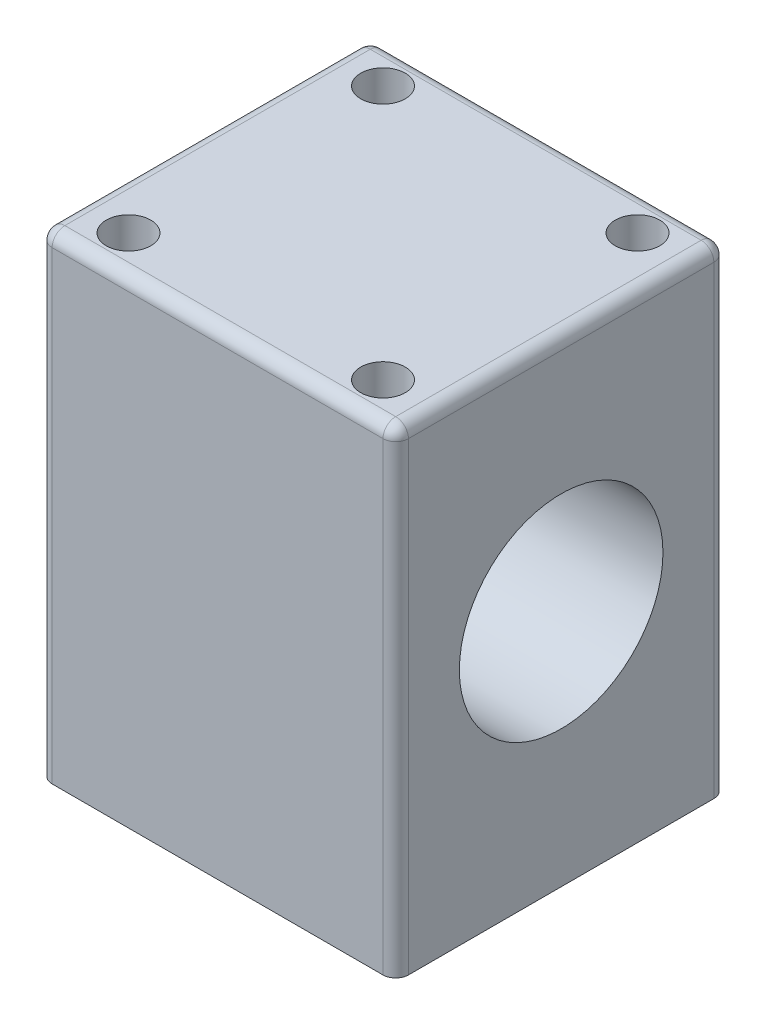
ISO-10303-21;
HEADER;
FILE_DESCRIPTION(('STEP AP214'),'2;1');
FILE_NAME('part.step','',(''),(''),'','','');
FILE_SCHEMA(('AUTOMOTIVE_DESIGN { 1 0 10303 214 1 1 1 1 }'));
ENDSEC;
DATA;
#1=APPLICATION_CONTEXT('core data for automotive mechanical design processes');
#2=APPLICATION_PROTOCOL_DEFINITION('international standard','automotive_design',2000,#1);
#3=PRODUCT_CONTEXT('',#1,'mechanical');
#4=PRODUCT('Part','Part','',(#3));
#5=PRODUCT_RELATED_PRODUCT_CATEGORY('part','',(#4));
#6=PRODUCT_DEFINITION_FORMATION('','',#4);
#7=PRODUCT_DEFINITION_CONTEXT('part definition',#1,'design');
#8=PRODUCT_DEFINITION('design','',#6,#7);
#9=PRODUCT_DEFINITION_SHAPE('','',#8);
#10=(LENGTH_UNIT() NAMED_UNIT(*) SI_UNIT(.MILLI.,.METRE.));
#11=(NAMED_UNIT(*) PLANE_ANGLE_UNIT() SI_UNIT($,.RADIAN.));
#12=(NAMED_UNIT(*) SI_UNIT($,.STERADIAN.) SOLID_ANGLE_UNIT());
#13=UNCERTAINTY_MEASURE_WITH_UNIT(LENGTH_MEASURE(1.E-05),#10,'distance_accuracy_value','');
#14=(GEOMETRIC_REPRESENTATION_CONTEXT(3) GLOBAL_UNCERTAINTY_ASSIGNED_CONTEXT((#13)) GLOBAL_UNIT_ASSIGNED_CONTEXT((#10,
#11,#12)) REPRESENTATION_CONTEXT('',''));
#15=CARTESIAN_POINT('',(0.,0.,0.));
#16=DIRECTION('',(0.,0.,1.));
#17=DIRECTION('',(1.,0.,0.));
#18=AXIS2_PLACEMENT_3D('',#15,#16,#17);
#19=CARTESIAN_POINT('',(14.,0.,0.));
#20=DIRECTION('',(-1.,0.,0.));
#21=DIRECTION('',(0.,0.,1.));
#22=AXIS2_PLACEMENT_3D('',#19,#20,#21);
#23=CYLINDRICAL_SURFACE('',#22,8.);
#24=CARTESIAN_POINT('',(14.,0.,0.));
#25=DIRECTION('',(1.,0.,0.));
#26=DIRECTION('',(0.,0.,-1.));
#27=AXIS2_PLACEMENT_3D('',#24,#25,#26);
#28=CIRCLE('',#27,8.);
#29=CARTESIAN_POINT('',(14.,0.,-8.));
#30=VERTEX_POINT('',#29);
#31=EDGE_CURVE('E241',#30,#30,#28,.T.);
#32=ORIENTED_EDGE('',*,*,#31,.T.);
#33=EDGE_LOOP('',(#32));
#34=FACE_BOUND('',#33,.T.);
#35=CARTESIAN_POINT('',(-11.,0.,0.));
#36=DIRECTION('',(-1.,0.,0.));
#37=DIRECTION('',(0.,0.,1.));
#38=AXIS2_PLACEMENT_3D('',#35,#36,#37);
#39=CIRCLE('',#38,8.);
#40=CARTESIAN_POINT('',(-11.,0.,8.));
#41=VERTEX_POINT('',#40);
#42=EDGE_CURVE('E216',#41,#41,#39,.T.);
#43=ORIENTED_EDGE('',*,*,#42,.T.);
#44=EDGE_LOOP('',(#43));
#45=FACE_BOUND('',#44,.T.);
#46=ADVANCED_FACE('F37',(#34,#45),#23,.F.);
#47=CARTESIAN_POINT('',(14.,0.,0.));
#48=DIRECTION('',(-1.,0.,0.));
#49=DIRECTION('',(0.,0.,1.));
#50=AXIS2_PLACEMENT_3D('',#47,#48,#49);
#51=PLANE('',#50);
#52=DIRECTION('',(0.,0.,1.));
#53=VECTOR('',#52,1.);
#54=CARTESIAN_POINT('',(14.,17.75,0.));
#55=LINE('',#54,#53);
#56=CARTESIAN_POINT('',(14.,17.75,-12.));
#57=VERTEX_POINT('',#56);
#58=CARTESIAN_POINT('',(14.,17.75,12.));
#59=VERTEX_POINT('',#58);
#60=EDGE_CURVE('E160',#57,#59,#55,.T.);
#61=ORIENTED_EDGE('',*,*,#60,.T.);
#62=DIRECTION('',(0.,-1.,0.));
#63=VECTOR('',#62,1.);
#64=CARTESIAN_POINT('',(14.,0.,12.));
#65=LINE('',#64,#63);
#66=CARTESIAN_POINT('',(14.,-18.75,12.));
#67=VERTEX_POINT('',#66);
#68=EDGE_CURVE('E164',#59,#67,#65,.T.);
#69=ORIENTED_EDGE('',*,*,#68,.T.);
#70=DIRECTION('',(0.,0.,-1.));
#71=VECTOR('',#70,1.);
#72=CARTESIAN_POINT('',(14.,-18.75,13.));
#73=LINE('',#72,#71);
#74=CARTESIAN_POINT('',(14.,-18.75,-12.));
#75=VERTEX_POINT('',#74);
#76=EDGE_CURVE('E124',#67,#75,#73,.T.);
#77=ORIENTED_EDGE('',*,*,#76,.T.);
#78=DIRECTION('',(0.,1.,0.));
#79=VECTOR('',#78,1.);
#80=CARTESIAN_POINT('',(14.,0.,-12.));
#81=LINE('',#80,#79);
#82=EDGE_CURVE('E162',#75,#57,#81,.T.);
#83=ORIENTED_EDGE('',*,*,#82,.T.);
#84=EDGE_LOOP('',(#61,#69,#77,#83));
#85=FACE_BOUND('',#84,.T.);
#86=ORIENTED_EDGE('',*,*,#31,.F.);
#87=EDGE_LOOP('',(#86));
#88=FACE_BOUND('',#87,.T.);
#89=ADVANCED_FACE('F272',(#85,#88),#51,.F.);
#90=CARTESIAN_POINT('',(-14.,0.,0.));
#91=DIRECTION('',(-1.,0.,0.));
#92=DIRECTION('',(0.,0.,1.));
#93=AXIS2_PLACEMENT_3D('',#90,#91,#92);
#94=PLANE('',#93);
#95=DIRECTION('',(0.,0.,-1.));
#96=VECTOR('',#95,1.);
#97=CARTESIAN_POINT('',(-14.,-18.75,13.));
#98=LINE('',#97,#96);
#99=CARTESIAN_POINT('',(-14.,-18.75,12.));
#100=VERTEX_POINT('',#99);
#101=CARTESIAN_POINT('',(-14.,-18.75,-12.));
#102=VERTEX_POINT('',#101);
#103=EDGE_CURVE('E246',#100,#102,#98,.T.);
#104=ORIENTED_EDGE('',*,*,#103,.F.);
#105=DIRECTION('',(0.,-1.,0.));
#106=VECTOR('',#105,1.);
#107=CARTESIAN_POINT('',(-14.,18.75,12.));
#108=LINE('',#107,#106);
#109=CARTESIAN_POINT('',(-14.,17.75,12.));
#110=VERTEX_POINT('',#109);
#111=EDGE_CURVE('E158',#100,#110,#108,.F.);
#112=ORIENTED_EDGE('',*,*,#111,.T.);
#113=DIRECTION('',(0.,0.,1.));
#114=VECTOR('',#113,1.);
#115=CARTESIAN_POINT('',(-14.,17.75,-13.));
#116=LINE('',#115,#114);
#117=CARTESIAN_POINT('',(-14.,17.75,-12.));
#118=VERTEX_POINT('',#117);
#119=EDGE_CURVE('E154',#110,#118,#116,.F.);
#120=ORIENTED_EDGE('',*,*,#119,.T.);
#121=DIRECTION('',(0.,1.,0.));
#122=VECTOR('',#121,1.);
#123=CARTESIAN_POINT('',(-14.,-18.75,-12.));
#124=LINE('',#123,#122);
#125=EDGE_CURVE('E156',#118,#102,#124,.F.);
#126=ORIENTED_EDGE('',*,*,#125,.T.);
#127=EDGE_LOOP('',(#104,#112,#120,#126));
#128=FACE_BOUND('',#127,.T.);
#129=CARTESIAN_POINT('',(-14.,0.,0.));
#130=DIRECTION('',(-1.,0.,0.));
#131=DIRECTION('',(0.,0.,1.));
#132=AXIS2_PLACEMENT_3D('',#129,#130,#131);
#133=CIRCLE('',#132,6.);
#134=CARTESIAN_POINT('',(-14.,0.,6.));
#135=VERTEX_POINT('',#134);
#136=EDGE_CURVE('E206',#135,#135,#133,.T.);
#137=ORIENTED_EDGE('',*,*,#136,.F.);
#138=EDGE_LOOP('',(#137));
#139=FACE_BOUND('',#138,.T.);
#140=ADVANCED_FACE('F278',(#128,#139),#94,.T.);
#141=CARTESIAN_POINT('',(14.,-18.75,-13.));
#142=DIRECTION('',(0.,0.,1.));
#143=DIRECTION('',(1.,0.,0.));
#144=AXIS2_PLACEMENT_3D('',#141,#142,#143);
#145=PLANE('',#144);
#146=DIRECTION('',(-1.,0.,0.));
#147=VECTOR('',#146,1.);
#148=CARTESIAN_POINT('',(14.,-18.75,-13.));
#149=LINE('',#148,#147);
#150=CARTESIAN_POINT('',(13.,-18.75,-13.));
#151=VERTEX_POINT('',#150);
#152=CARTESIAN_POINT('',(-13.,-18.75,-13.));
#153=VERTEX_POINT('',#152);
#154=EDGE_CURVE('E139',#151,#153,#149,.T.);
#155=ORIENTED_EDGE('',*,*,#154,.T.);
#156=DIRECTION('',(0.,1.,0.));
#157=VECTOR('',#156,1.);
#158=CARTESIAN_POINT('',(-13.,18.75,-13.));
#159=LINE('',#158,#157);
#160=CARTESIAN_POINT('',(-13.,17.75,-13.));
#161=VERTEX_POINT('',#160);
#162=EDGE_CURVE('E170',#153,#161,#159,.T.);
#163=ORIENTED_EDGE('',*,*,#162,.T.);
#164=DIRECTION('',(-1.,0.,0.));
#165=VECTOR('',#164,1.);
#166=CARTESIAN_POINT('',(14.,17.75,-13.));
#167=LINE('',#166,#165);
#168=CARTESIAN_POINT('',(13.,17.75,-13.));
#169=VERTEX_POINT('',#168);
#170=EDGE_CURVE('E166',#161,#169,#167,.F.);
#171=ORIENTED_EDGE('',*,*,#170,.T.);
#172=DIRECTION('',(0.,1.,0.));
#173=VECTOR('',#172,1.);
#174=CARTESIAN_POINT('',(13.,-18.75,-13.));
#175=LINE('',#174,#173);
#176=EDGE_CURVE('E168',#169,#151,#175,.F.);
#177=ORIENTED_EDGE('',*,*,#176,.T.);
#178=EDGE_LOOP('',(#155,#163,#171,#177));
#179=FACE_BOUND('',#178,.T.);
#180=ADVANCED_FACE('F287',(#179),#145,.F.);
#181=CARTESIAN_POINT('',(14.,18.75,13.));
#182=DIRECTION('',(0.,-1.,0.));
#183=DIRECTION('',(0.,0.,-1.));
#184=AXIS2_PLACEMENT_3D('',#181,#182,#183);
#185=PLANE('',#184);
#186=DIRECTION('',(-1.,0.,0.));
#187=VECTOR('',#186,1.);
#188=CARTESIAN_POINT('',(14.,18.75,-12.));
#189=LINE('',#188,#187);
#190=CARTESIAN_POINT('',(13.,18.75,-12.));
#191=VERTEX_POINT('',#190);
#192=CARTESIAN_POINT('',(-13.,18.75,-12.));
#193=VERTEX_POINT('',#192);
#194=EDGE_CURVE('E61',#191,#193,#189,.T.);
#195=ORIENTED_EDGE('',*,*,#194,.T.);
#196=DIRECTION('',(0.,0.,1.));
#197=VECTOR('',#196,1.);
#198=CARTESIAN_POINT('',(-13.,18.75,13.));
#199=LINE('',#198,#197);
#200=CARTESIAN_POINT('',(-13.,18.75,12.));
#201=VERTEX_POINT('',#200);
#202=EDGE_CURVE('E11',#193,#201,#199,.T.);
#203=ORIENTED_EDGE('',*,*,#202,.T.);
#204=DIRECTION('',(-1.,0.,0.));
#205=VECTOR('',#204,1.);
#206=CARTESIAN_POINT('',(14.,18.75,12.));
#207=LINE('',#206,#205);
#208=CARTESIAN_POINT('',(13.,18.75,12.));
#209=VERTEX_POINT('',#208);
#210=EDGE_CURVE('E46',#201,#209,#207,.F.);
#211=ORIENTED_EDGE('',*,*,#210,.T.);
#212=DIRECTION('',(0.,0.,1.));
#213=VECTOR('',#212,1.);
#214=CARTESIAN_POINT('',(13.,18.75,13.));
#215=LINE('',#214,#213);
#216=EDGE_CURVE('E172',#209,#191,#215,.F.);
#217=ORIENTED_EDGE('',*,*,#216,.T.);
#218=EDGE_LOOP('',(#195,#203,#211,#217));
#219=FACE_BOUND('',#218,.T.);
#220=CARTESIAN_POINT('',(-10.,18.75,10.));
#221=DIRECTION('',(0.,1.,0.));
#222=DIRECTION('',(0.,0.,1.));
#223=AXIS2_PLACEMENT_3D('',#220,#221,#222);
#224=CIRCLE('',#223,1.75);
#225=CARTESIAN_POINT('',(-10.,18.75,11.75));
#226=VERTEX_POINT('',#225);
#227=EDGE_CURVE('E235',#226,#226,#224,.T.);
#228=ORIENTED_EDGE('',*,*,#227,.F.);
#229=EDGE_LOOP('',(#228));
#230=FACE_BOUND('',#229,.T.);
#231=CARTESIAN_POINT('',(10.,18.75,9.99999999999999));
#232=DIRECTION('',(0.,1.,0.));
#233=DIRECTION('',(0.,0.,1.));
#234=AXIS2_PLACEMENT_3D('',#231,#232,#233);
#235=CIRCLE('',#234,1.75);
#236=CARTESIAN_POINT('',(10.,18.75,11.75));
#237=VERTEX_POINT('',#236);
#238=EDGE_CURVE('E229',#237,#237,#235,.T.);
#239=ORIENTED_EDGE('',*,*,#238,.F.);
#240=EDGE_LOOP('',(#239));
#241=FACE_BOUND('',#240,.T.);
#242=CARTESIAN_POINT('',(10.,18.75,-10.));
#243=DIRECTION('',(0.,1.,0.));
#244=DIRECTION('',(0.,0.,1.));
#245=AXIS2_PLACEMENT_3D('',#242,#243,#244);
#246=CIRCLE('',#245,1.75);
#247=CARTESIAN_POINT('',(10.,18.75,-8.25000000000001));
#248=VERTEX_POINT('',#247);
#249=EDGE_CURVE('E223',#248,#248,#246,.T.);
#250=ORIENTED_EDGE('',*,*,#249,.F.);
#251=EDGE_LOOP('',(#250));
#252=FACE_BOUND('',#251,.T.);
#253=CARTESIAN_POINT('',(-10.,18.75,-10.));
#254=DIRECTION('',(0.,1.,0.));
#255=DIRECTION('',(0.,0.,1.));
#256=AXIS2_PLACEMENT_3D('',#253,#254,#255);
#257=CIRCLE('',#256,1.75);
#258=CARTESIAN_POINT('',(-10.,18.75,-8.25));
#259=VERTEX_POINT('',#258);
#260=EDGE_CURVE('E222',#259,#259,#257,.T.);
#261=ORIENTED_EDGE('',*,*,#260,.F.);
#262=EDGE_LOOP('',(#261));
#263=FACE_BOUND('',#262,.T.);
#264=ADVANCED_FACE('F293',(#219,#230,#241,#252,#263),#185,.F.);
#265=CARTESIAN_POINT('',(14.,-18.75,13.));
#266=DIRECTION('',(0.,0.,-1.));
#267=DIRECTION('',(-1.,0.,0.));
#268=AXIS2_PLACEMENT_3D('',#265,#266,#267);
#269=PLANE('',#268);
#270=DIRECTION('',(-1.,0.,0.));
#271=VECTOR('',#270,1.);
#272=CARTESIAN_POINT('',(14.,17.75,13.));
#273=LINE('',#272,#271);
#274=CARTESIAN_POINT('',(13.,17.75,13.));
#275=VERTEX_POINT('',#274);
#276=CARTESIAN_POINT('',(-13.,17.75,13.));
#277=VERTEX_POINT('',#276);
#278=EDGE_CURVE('E138',#275,#277,#273,.T.);
#279=ORIENTED_EDGE('',*,*,#278,.T.);
#280=DIRECTION('',(0.,-1.,0.));
#281=VECTOR('',#280,1.);
#282=CARTESIAN_POINT('',(-13.,-18.75,13.));
#283=LINE('',#282,#281);
#284=CARTESIAN_POINT('',(-13.,-18.75,13.));
#285=VERTEX_POINT('',#284);
#286=EDGE_CURVE('E137',#277,#285,#283,.T.);
#287=ORIENTED_EDGE('',*,*,#286,.T.);
#288=DIRECTION('',(-1.,0.,0.));
#289=VECTOR('',#288,1.);
#290=CARTESIAN_POINT('',(14.,-18.75,13.));
#291=LINE('',#290,#289);
#292=CARTESIAN_POINT('',(13.,-18.75,13.));
#293=VERTEX_POINT('',#292);
#294=EDGE_CURVE('E122',#293,#285,#291,.T.);
#295=ORIENTED_EDGE('',*,*,#294,.F.);
#296=DIRECTION('',(0.,-1.,0.));
#297=VECTOR('',#296,1.);
#298=CARTESIAN_POINT('',(13.,-18.75,13.));
#299=LINE('',#298,#297);
#300=EDGE_CURVE('E134',#293,#275,#299,.F.);
#301=ORIENTED_EDGE('',*,*,#300,.T.);
#302=EDGE_LOOP('',(#279,#287,#295,#301));
#303=FACE_BOUND('',#302,.T.);
#304=ADVANCED_FACE('F133',(#303),#269,.F.);
#305=CARTESIAN_POINT('',(14.,-18.75,13.));
#306=DIRECTION('',(0.,1.,0.));
#307=DIRECTION('',(0.,0.,1.));
#308=AXIS2_PLACEMENT_3D('',#305,#306,#307);
#309=PLANE('',#308);
#310=ORIENTED_EDGE('',*,*,#294,.T.);
#311=CARTESIAN_POINT('',(-13.,-18.75,12.));
#312=DIRECTION('',(0.,1.,0.));
#313=DIRECTION('',(0.,0.,1.));
#314=AXIS2_PLACEMENT_3D('',#311,#312,#313);
#315=CIRCLE('',#314,1.);
#316=EDGE_CURVE('E128',#285,#100,#315,.F.);
#317=ORIENTED_EDGE('',*,*,#316,.T.);
#318=ORIENTED_EDGE('',*,*,#103,.T.);
#319=CARTESIAN_POINT('',(-13.,-18.75,-12.));
#320=DIRECTION('',(0.,1.,0.));
#321=DIRECTION('',(0.,0.,1.));
#322=AXIS2_PLACEMENT_3D('',#319,#320,#321);
#323=CIRCLE('',#322,1.);
#324=EDGE_CURVE('E129',#102,#153,#323,.F.);
#325=ORIENTED_EDGE('',*,*,#324,.T.);
#326=ORIENTED_EDGE('',*,*,#154,.F.);
#327=CARTESIAN_POINT('',(13.,-18.75,-12.));
#328=DIRECTION('',(0.,1.,0.));
#329=DIRECTION('',(0.,0.,1.));
#330=AXIS2_PLACEMENT_3D('',#327,#328,#329);
#331=CIRCLE('',#330,1.);
#332=EDGE_CURVE('E146',#151,#75,#331,.F.);
#333=ORIENTED_EDGE('',*,*,#332,.T.);
#334=ORIENTED_EDGE('',*,*,#76,.F.);
#335=CARTESIAN_POINT('',(13.,-18.75,12.));
#336=DIRECTION('',(0.,1.,0.));
#337=DIRECTION('',(0.,0.,1.));
#338=AXIS2_PLACEMENT_3D('',#335,#336,#337);
#339=CIRCLE('',#338,1.);
#340=EDGE_CURVE('E119',#67,#293,#339,.F.);
#341=ORIENTED_EDGE('',*,*,#340,.T.);
#342=EDGE_LOOP('',(#310,#317,#318,#325,#326,#333,#334,#341));
#343=FACE_BOUND('',#342,.T.);
#344=ADVANCED_FACE('F121',(#343),#309,.F.);
#345=CARTESIAN_POINT('',(-10.,-13.25,-10.));
#346=DIRECTION('',(0.,1.,0.));
#347=DIRECTION('',(0.,0.,1.));
#348=AXIS2_PLACEMENT_3D('',#345,#346,#347);
#349=CYLINDRICAL_SURFACE('',#348,1.75);
#350=CARTESIAN_POINT('',(-10.,-13.25,-10.));
#351=DIRECTION('',(0.,1.,0.));
#352=DIRECTION('',(0.,0.,1.));
#353=AXIS2_PLACEMENT_3D('',#350,#351,#352);
#354=CIRCLE('',#353,1.75);
#355=CARTESIAN_POINT('',(-10.,-13.25,-8.25));
#356=VERTEX_POINT('',#355);
#357=EDGE_CURVE('E238',#356,#356,#354,.T.);
#358=ORIENTED_EDGE('',*,*,#357,.F.);
#359=EDGE_LOOP('',(#358));
#360=FACE_BOUND('',#359,.T.);
#361=ORIENTED_EDGE('',*,*,#260,.T.);
#362=EDGE_LOOP('',(#361));
#363=FACE_BOUND('',#362,.T.);
#364=ADVANCED_FACE('F282',(#360,#363),#349,.F.);
#365=CARTESIAN_POINT('',(-10.,-13.25,-10.));
#366=DIRECTION('',(0.,1.,0.));
#367=DIRECTION('',(0.,0.,1.));
#368=AXIS2_PLACEMENT_3D('',#365,#366,#367);
#369=PLANE('',#368);
#370=ORIENTED_EDGE('',*,*,#357,.T.);
#371=EDGE_LOOP('',(#370));
#372=FACE_BOUND('',#371,.T.);
#373=ADVANCED_FACE('F370',(#372),#369,.T.);
#374=CARTESIAN_POINT('',(10.,-13.25,-10.));
#375=DIRECTION('',(0.,1.,0.));
#376=DIRECTION('',(0.,0.,1.));
#377=AXIS2_PLACEMENT_3D('',#374,#375,#376);
#378=CYLINDRICAL_SURFACE('',#377,1.75);
#379=CARTESIAN_POINT('',(10.,-13.25,-10.));
#380=DIRECTION('',(0.,1.,0.));
#381=DIRECTION('',(0.,0.,1.));
#382=AXIS2_PLACEMENT_3D('',#379,#380,#381);
#383=CIRCLE('',#382,1.75);
#384=CARTESIAN_POINT('',(10.,-13.25,-8.25000000000001));
#385=VERTEX_POINT('',#384);
#386=EDGE_CURVE('E219',#385,#385,#383,.T.);
#387=ORIENTED_EDGE('',*,*,#386,.F.);
#388=EDGE_LOOP('',(#387));
#389=FACE_BOUND('',#388,.T.);
#390=ORIENTED_EDGE('',*,*,#249,.T.);
#391=EDGE_LOOP('',(#390));
#392=FACE_BOUND('',#391,.T.);
#393=ADVANCED_FACE('F375',(#389,#392),#378,.F.);
#394=CARTESIAN_POINT('',(10.,-13.25,-10.));
#395=DIRECTION('',(0.,1.,0.));
#396=DIRECTION('',(0.,0.,1.));
#397=AXIS2_PLACEMENT_3D('',#394,#395,#396);
#398=PLANE('',#397);
#399=ORIENTED_EDGE('',*,*,#386,.T.);
#400=EDGE_LOOP('',(#399));
#401=FACE_BOUND('',#400,.T.);
#402=ADVANCED_FACE('F381',(#401),#398,.T.);
#403=CARTESIAN_POINT('',(10.,-13.25,9.99999999999999));
#404=DIRECTION('',(0.,1.,0.));
#405=DIRECTION('',(0.,0.,1.));
#406=AXIS2_PLACEMENT_3D('',#403,#404,#405);
#407=CYLINDRICAL_SURFACE('',#406,1.75);
#408=CARTESIAN_POINT('',(10.,-13.25,9.99999999999999));
#409=DIRECTION('',(0.,1.,0.));
#410=DIRECTION('',(0.,0.,1.));
#411=AXIS2_PLACEMENT_3D('',#408,#409,#410);
#412=CIRCLE('',#411,1.75);
#413=CARTESIAN_POINT('',(10.,-13.25,11.75));
#414=VERTEX_POINT('',#413);
#415=EDGE_CURVE('E226',#414,#414,#412,.T.);
#416=ORIENTED_EDGE('',*,*,#415,.F.);
#417=EDGE_LOOP('',(#416));
#418=FACE_BOUND('',#417,.T.);
#419=ORIENTED_EDGE('',*,*,#238,.T.);
#420=EDGE_LOOP('',(#419));
#421=FACE_BOUND('',#420,.T.);
#422=ADVANCED_FACE('F389',(#418,#421),#407,.F.);
#423=CARTESIAN_POINT('',(10.,-13.25,9.99999999999999));
#424=DIRECTION('',(0.,1.,0.));
#425=DIRECTION('',(0.,0.,1.));
#426=AXIS2_PLACEMENT_3D('',#423,#424,#425);
#427=PLANE('',#426);
#428=ORIENTED_EDGE('',*,*,#415,.T.);
#429=EDGE_LOOP('',(#428));
#430=FACE_BOUND('',#429,.T.);
#431=ADVANCED_FACE('F386',(#430),#427,.T.);
#432=CARTESIAN_POINT('',(-10.,-13.25,10.));
#433=DIRECTION('',(0.,1.,0.));
#434=DIRECTION('',(0.,0.,1.));
#435=AXIS2_PLACEMENT_3D('',#432,#433,#434);
#436=CYLINDRICAL_SURFACE('',#435,1.75);
#437=CARTESIAN_POINT('',(-10.,-13.25,10.));
#438=DIRECTION('',(0.,1.,0.));
#439=DIRECTION('',(0.,0.,1.));
#440=AXIS2_PLACEMENT_3D('',#437,#438,#439);
#441=CIRCLE('',#440,1.75);
#442=CARTESIAN_POINT('',(-10.,-13.25,11.75));
#443=VERTEX_POINT('',#442);
#444=EDGE_CURVE('E232',#443,#443,#441,.T.);
#445=ORIENTED_EDGE('',*,*,#444,.F.);
#446=EDGE_LOOP('',(#445));
#447=FACE_BOUND('',#446,.T.);
#448=ORIENTED_EDGE('',*,*,#227,.T.);
#449=EDGE_LOOP('',(#448));
#450=FACE_BOUND('',#449,.T.);
#451=ADVANCED_FACE('F267',(#447,#450),#436,.F.);
#452=CARTESIAN_POINT('',(-10.,-13.25,10.));
#453=DIRECTION('',(0.,1.,0.));
#454=DIRECTION('',(0.,0.,1.));
#455=AXIS2_PLACEMENT_3D('',#452,#453,#454);
#456=PLANE('',#455);
#457=ORIENTED_EDGE('',*,*,#444,.T.);
#458=EDGE_LOOP('',(#457));
#459=FACE_BOUND('',#458,.T.);
#460=ADVANCED_FACE('F258',(#459),#456,.T.);
#461=CARTESIAN_POINT('',(-11.,0.,0.));
#462=DIRECTION('',(-1.,0.,0.));
#463=DIRECTION('',(0.,0.,1.));
#464=AXIS2_PLACEMENT_3D('',#461,#462,#463);
#465=PLANE('',#464);
#466=CARTESIAN_POINT('',(-11.,0.,0.));
#467=DIRECTION('',(-1.,0.,0.));
#468=DIRECTION('',(0.,0.,1.));
#469=AXIS2_PLACEMENT_3D('',#466,#467,#468);
#470=CIRCLE('',#469,6.);
#471=CARTESIAN_POINT('',(-11.,0.,6.));
#472=VERTEX_POINT('',#471);
#473=EDGE_CURVE('E211',#472,#472,#470,.T.);
#474=ORIENTED_EDGE('',*,*,#473,.T.);
#475=EDGE_LOOP('',(#474));
#476=FACE_BOUND('',#475,.T.);
#477=ORIENTED_EDGE('',*,*,#42,.F.);
#478=EDGE_LOOP('',(#477));
#479=FACE_BOUND('',#478,.T.);
#480=ADVANCED_FACE('F255',(#476,#479),#465,.F.);
#481=CARTESIAN_POINT('',(-11.,0.,0.));
#482=DIRECTION('',(-1.,0.,0.));
#483=DIRECTION('',(0.,0.,1.));
#484=AXIS2_PLACEMENT_3D('',#481,#482,#483);
#485=CYLINDRICAL_SURFACE('',#484,6.);
#486=ORIENTED_EDGE('',*,*,#473,.F.);
#487=EDGE_LOOP('',(#486));
#488=FACE_BOUND('',#487,.T.);
#489=ORIENTED_EDGE('',*,*,#136,.T.);
#490=EDGE_LOOP('',(#489));
#491=FACE_BOUND('',#490,.T.);
#492=ADVANCED_FACE('F257',(#488,#491),#485,.F.);
#493=CARTESIAN_POINT('',(13.,0.,-12.));
#494=DIRECTION('',(0.,1.,0.));
#495=DIRECTION('',(0.,0.,1.));
#496=AXIS2_PLACEMENT_3D('',#493,#494,#495);
#497=CYLINDRICAL_SURFACE('',#496,1.);
#498=CARTESIAN_POINT('',(13.,17.75,-12.));
#499=DIRECTION('',(0.,1.,0.));
#500=DIRECTION('',(0.,0.,1.));
#501=AXIS2_PLACEMENT_3D('',#498,#499,#500);
#502=CIRCLE('',#501,1.);
#503=EDGE_CURVE('E41',#57,#169,#502,.T.);
#504=ORIENTED_EDGE('',*,*,#503,.F.);
#505=ORIENTED_EDGE('',*,*,#82,.F.);
#506=ORIENTED_EDGE('',*,*,#332,.F.);
#507=ORIENTED_EDGE('',*,*,#176,.F.);
#508=EDGE_LOOP('',(#504,#505,#506,#507));
#509=FACE_BOUND('',#508,.T.);
#510=ADVANCED_FACE('F39',(#509),#497,.T.);
#511=CARTESIAN_POINT('',(13.,17.75,-12.));
#512=DIRECTION('',(0.,0.,1.));
#513=DIRECTION('',(1.,0.,0.));
#514=AXIS2_PLACEMENT_3D('',#511,#512,#513);
#515=SPHERICAL_SURFACE('',#514,1.);
#516=CARTESIAN_POINT('',(13.,17.75,-12.));
#517=DIRECTION('',(0.,0.,-1.));
#518=DIRECTION('',(-1.,0.,0.));
#519=AXIS2_PLACEMENT_3D('',#516,#517,#518);
#520=CIRCLE('',#519,1.);
#521=EDGE_CURVE('E198',#57,#191,#520,.F.);
#522=ORIENTED_EDGE('',*,*,#521,.F.);
#523=ORIENTED_EDGE('',*,*,#503,.T.);
#524=CARTESIAN_POINT('',(13.,17.75,-12.));
#525=DIRECTION('',(1.,0.,0.));
#526=DIRECTION('',(0.,0.,-1.));
#527=AXIS2_PLACEMENT_3D('',#524,#525,#526);
#528=CIRCLE('',#527,1.);
#529=EDGE_CURVE('E200',#191,#169,#528,.F.);
#530=ORIENTED_EDGE('',*,*,#529,.F.);
#531=EDGE_LOOP('',(#522,#523,#530));
#532=FACE_BOUND('',#531,.T.);
#533=ADVANCED_FACE('F333',(#532),#515,.T.);
#534=CARTESIAN_POINT('',(-13.,-18.75,-12.));
#535=DIRECTION('',(0.,-1.,0.));
#536=DIRECTION('',(0.,0.,-1.));
#537=AXIS2_PLACEMENT_3D('',#534,#535,#536);
#538=CYLINDRICAL_SURFACE('',#537,1.);
#539=ORIENTED_EDGE('',*,*,#324,.F.);
#540=ORIENTED_EDGE('',*,*,#125,.F.);
#541=CARTESIAN_POINT('',(-13.,17.75,-12.));
#542=DIRECTION('',(0.,1.,0.));
#543=DIRECTION('',(0.,0.,1.));
#544=AXIS2_PLACEMENT_3D('',#541,#542,#543);
#545=CIRCLE('',#544,1.);
#546=EDGE_CURVE('E195',#161,#118,#545,.T.);
#547=ORIENTED_EDGE('',*,*,#546,.F.);
#548=ORIENTED_EDGE('',*,*,#162,.F.);
#549=EDGE_LOOP('',(#539,#540,#547,#548));
#550=FACE_BOUND('',#549,.T.);
#551=ADVANCED_FACE('F331',(#550),#538,.T.);
#552=CARTESIAN_POINT('',(14.,17.75,-12.));
#553=DIRECTION('',(-1.,0.,0.));
#554=DIRECTION('',(0.,0.,1.));
#555=AXIS2_PLACEMENT_3D('',#552,#553,#554);
#556=CYLINDRICAL_SURFACE('',#555,1.);
#557=ORIENTED_EDGE('',*,*,#529,.T.);
#558=ORIENTED_EDGE('',*,*,#170,.F.);
#559=CARTESIAN_POINT('',(-13.,17.75,-12.));
#560=DIRECTION('',(-1.,0.,0.));
#561=DIRECTION('',(0.,0.,1.));
#562=AXIS2_PLACEMENT_3D('',#559,#560,#561);
#563=CIRCLE('',#562,1.);
#564=EDGE_CURVE('E192',#193,#161,#563,.T.);
#565=ORIENTED_EDGE('',*,*,#564,.F.);
#566=ORIENTED_EDGE('',*,*,#194,.F.);
#567=EDGE_LOOP('',(#557,#558,#565,#566));
#568=FACE_BOUND('',#567,.T.);
#569=ADVANCED_FACE('F327',(#568),#556,.T.);
#570=CARTESIAN_POINT('',(13.,17.75,0.));
#571=DIRECTION('',(0.,0.,1.));
#572=DIRECTION('',(1.,0.,0.));
#573=AXIS2_PLACEMENT_3D('',#570,#571,#572);
#574=CYLINDRICAL_SURFACE('',#573,1.);
#575=ORIENTED_EDGE('',*,*,#521,.T.);
#576=ORIENTED_EDGE('',*,*,#216,.F.);
#577=CARTESIAN_POINT('',(13.,17.75,12.));
#578=DIRECTION('',(0.,0.,1.));
#579=DIRECTION('',(1.,0.,0.));
#580=AXIS2_PLACEMENT_3D('',#577,#578,#579);
#581=CIRCLE('',#580,1.);
#582=EDGE_CURVE('E189',#59,#209,#581,.T.);
#583=ORIENTED_EDGE('',*,*,#582,.F.);
#584=ORIENTED_EDGE('',*,*,#60,.F.);
#585=EDGE_LOOP('',(#575,#576,#583,#584));
#586=FACE_BOUND('',#585,.T.);
#587=ADVANCED_FACE('F324',(#586),#574,.T.);
#588=CARTESIAN_POINT('',(13.,0.,12.));
#589=DIRECTION('',(0.,-1.,0.));
#590=DIRECTION('',(0.,0.,-1.));
#591=AXIS2_PLACEMENT_3D('',#588,#589,#590);
#592=CYLINDRICAL_SURFACE('',#591,1.);
#593=ORIENTED_EDGE('',*,*,#340,.F.);
#594=ORIENTED_EDGE('',*,*,#68,.F.);
#595=CARTESIAN_POINT('',(13.,17.75,12.));
#596=DIRECTION('',(0.,1.,0.));
#597=DIRECTION('',(0.,0.,1.));
#598=AXIS2_PLACEMENT_3D('',#595,#596,#597);
#599=CIRCLE('',#598,1.);
#600=EDGE_CURVE('E143',#275,#59,#599,.T.);
#601=ORIENTED_EDGE('',*,*,#600,.F.);
#602=ORIENTED_EDGE('',*,*,#300,.F.);
#603=EDGE_LOOP('',(#593,#594,#601,#602));
#604=FACE_BOUND('',#603,.T.);
#605=ADVANCED_FACE('F141',(#604),#592,.T.);
#606=CARTESIAN_POINT('',(-13.,17.75,-12.));
#607=DIRECTION('',(0.,0.,1.));
#608=DIRECTION('',(1.,0.,0.));
#609=AXIS2_PLACEMENT_3D('',#606,#607,#608);
#610=SPHERICAL_SURFACE('',#609,1.);
#611=ORIENTED_EDGE('',*,*,#564,.T.);
#612=ORIENTED_EDGE('',*,*,#546,.T.);
#613=CARTESIAN_POINT('',(-13.,17.75,-12.));
#614=DIRECTION('',(0.,0.,-1.));
#615=DIRECTION('',(-1.,0.,0.));
#616=AXIS2_PLACEMENT_3D('',#613,#614,#615);
#617=CIRCLE('',#616,1.);
#618=EDGE_CURVE('E185',#193,#118,#617,.F.);
#619=ORIENTED_EDGE('',*,*,#618,.F.);
#620=EDGE_LOOP('',(#611,#612,#619));
#621=FACE_BOUND('',#620,.T.);
#622=ADVANCED_FACE('F317',(#621),#610,.T.);
#623=CARTESIAN_POINT('',(13.,17.75,12.));
#624=DIRECTION('',(0.,0.,1.));
#625=DIRECTION('',(1.,0.,0.));
#626=AXIS2_PLACEMENT_3D('',#623,#624,#625);
#627=SPHERICAL_SURFACE('',#626,1.);
#628=ORIENTED_EDGE('',*,*,#600,.T.);
#629=ORIENTED_EDGE('',*,*,#582,.T.);
#630=CARTESIAN_POINT('',(13.,17.75,12.));
#631=DIRECTION('',(1.,0.,0.));
#632=DIRECTION('',(0.,0.,-1.));
#633=AXIS2_PLACEMENT_3D('',#630,#631,#632);
#634=CIRCLE('',#633,1.);
#635=EDGE_CURVE('E182',#275,#209,#634,.F.);
#636=ORIENTED_EDGE('',*,*,#635,.F.);
#637=EDGE_LOOP('',(#628,#629,#636));
#638=FACE_BOUND('',#637,.T.);
#639=ADVANCED_FACE('F313',(#638),#627,.T.);
#640=CARTESIAN_POINT('',(-13.,17.75,13.));
#641=DIRECTION('',(0.,0.,-1.));
#642=DIRECTION('',(-1.,0.,0.));
#643=AXIS2_PLACEMENT_3D('',#640,#641,#642);
#644=CYLINDRICAL_SURFACE('',#643,1.);
#645=ORIENTED_EDGE('',*,*,#618,.T.);
#646=ORIENTED_EDGE('',*,*,#119,.F.);
#647=CARTESIAN_POINT('',(-13.,17.75,12.));
#648=DIRECTION('',(0.,0.,1.));
#649=DIRECTION('',(1.,0.,0.));
#650=AXIS2_PLACEMENT_3D('',#647,#648,#649);
#651=CIRCLE('',#650,1.);
#652=EDGE_CURVE('E180',#201,#110,#651,.T.);
#653=ORIENTED_EDGE('',*,*,#652,.F.);
#654=ORIENTED_EDGE('',*,*,#202,.F.);
#655=EDGE_LOOP('',(#645,#646,#653,#654));
#656=FACE_BOUND('',#655,.T.);
#657=ADVANCED_FACE('F309',(#656),#644,.T.);
#658=CARTESIAN_POINT('',(14.,17.75,12.));
#659=DIRECTION('',(-1.,0.,0.));
#660=DIRECTION('',(0.,0.,1.));
#661=AXIS2_PLACEMENT_3D('',#658,#659,#660);
#662=CYLINDRICAL_SURFACE('',#661,1.);
#663=ORIENTED_EDGE('',*,*,#635,.T.);
#664=ORIENTED_EDGE('',*,*,#210,.F.);
#665=CARTESIAN_POINT('',(-13.,17.75,12.));
#666=DIRECTION('',(-1.,0.,0.));
#667=DIRECTION('',(0.,0.,1.));
#668=AXIS2_PLACEMENT_3D('',#665,#666,#667);
#669=CIRCLE('',#668,1.);
#670=EDGE_CURVE('E54',#277,#201,#669,.T.);
#671=ORIENTED_EDGE('',*,*,#670,.F.);
#672=ORIENTED_EDGE('',*,*,#278,.F.);
#673=EDGE_LOOP('',(#663,#664,#671,#672));
#674=FACE_BOUND('',#673,.T.);
#675=ADVANCED_FACE('F306',(#674),#662,.T.);
#676=CARTESIAN_POINT('',(-13.,17.75,12.));
#677=DIRECTION('',(0.,0.,1.));
#678=DIRECTION('',(1.,0.,0.));
#679=AXIS2_PLACEMENT_3D('',#676,#677,#678);
#680=SPHERICAL_SURFACE('',#679,1.);
#681=ORIENTED_EDGE('',*,*,#670,.T.);
#682=ORIENTED_EDGE('',*,*,#652,.T.);
#683=CARTESIAN_POINT('',(-13.,17.75,12.));
#684=DIRECTION('',(0.,1.,0.));
#685=DIRECTION('',(0.,0.,1.));
#686=AXIS2_PLACEMENT_3D('',#683,#684,#685);
#687=CIRCLE('',#686,1.);
#688=EDGE_CURVE('E176',#277,#110,#687,.F.);
#689=ORIENTED_EDGE('',*,*,#688,.F.);
#690=EDGE_LOOP('',(#681,#682,#689));
#691=FACE_BOUND('',#690,.T.);
#692=ADVANCED_FACE('F302',(#691),#680,.T.);
#693=CARTESIAN_POINT('',(-13.,-18.75,12.));
#694=DIRECTION('',(0.,1.,0.));
#695=DIRECTION('',(0.,0.,1.));
#696=AXIS2_PLACEMENT_3D('',#693,#694,#695);
#697=CYLINDRICAL_SURFACE('',#696,1.);
#698=ORIENTED_EDGE('',*,*,#688,.T.);
#699=ORIENTED_EDGE('',*,*,#111,.F.);
#700=ORIENTED_EDGE('',*,*,#316,.F.);
#701=ORIENTED_EDGE('',*,*,#286,.F.);
#702=EDGE_LOOP('',(#698,#699,#700,#701));
#703=FACE_BOUND('',#702,.T.);
#704=ADVANCED_FACE('F299',(#703),#697,.T.);
#705=CLOSED_SHELL('',(#46,#89,#140,#180,#264,#304,#344,#364,#373,#393,#402,#422,#431,#451,#460,
#480,#492,#510,#533,#551,#569,#587,#605,#622,#639,#657,#675,#692,#704));
#706=MANIFOLD_SOLID_BREP('B2',#705);
#707=ADVANCED_BREP_SHAPE_REPRESENTATION('',(#18,#706),#14);
#708=SHAPE_DEFINITION_REPRESENTATION(#9,#707);
ENDSEC;
END-ISO-10303-21;
